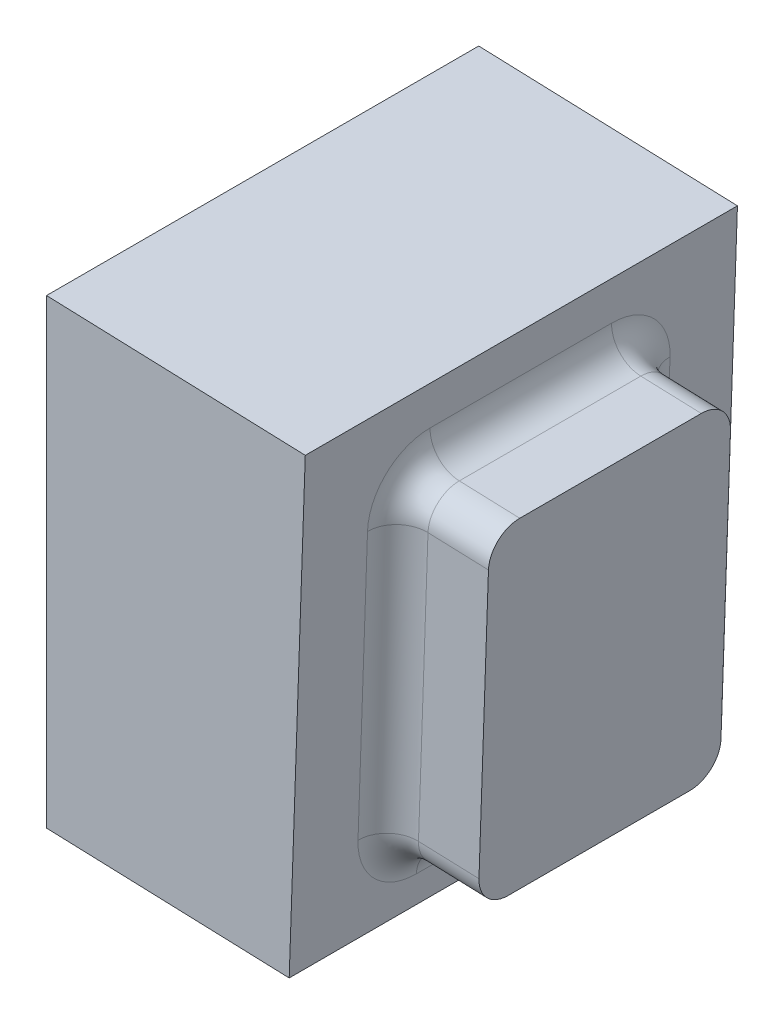
ISO-10303-21;
HEADER;
FILE_DESCRIPTION(('STEP AP214'),'2;1');
FILE_NAME('part.step','',(''),(''),'','','');
FILE_SCHEMA(('AUTOMOTIVE_DESIGN { 1 0 10303 214 1 1 1 1 }'));
ENDSEC;
DATA;
#1=APPLICATION_CONTEXT('core data for automotive mechanical design processes');
#2=APPLICATION_PROTOCOL_DEFINITION('international standard','automotive_design',2000,#1);
#3=PRODUCT_CONTEXT('',#1,'mechanical');
#4=PRODUCT('Part','Part','',(#3));
#5=PRODUCT_RELATED_PRODUCT_CATEGORY('part','',(#4));
#6=PRODUCT_DEFINITION_FORMATION('','',#4);
#7=PRODUCT_DEFINITION_CONTEXT('part definition',#1,'design');
#8=PRODUCT_DEFINITION('design','',#6,#7);
#9=PRODUCT_DEFINITION_SHAPE('','',#8);
#10=(LENGTH_UNIT() NAMED_UNIT(*) SI_UNIT(.MILLI.,.METRE.));
#11=(NAMED_UNIT(*) PLANE_ANGLE_UNIT() SI_UNIT($,.RADIAN.));
#12=(NAMED_UNIT(*) SI_UNIT($,.STERADIAN.) SOLID_ANGLE_UNIT());
#13=UNCERTAINTY_MEASURE_WITH_UNIT(LENGTH_MEASURE(1.E-05),#10,'distance_accuracy_value','');
#14=(GEOMETRIC_REPRESENTATION_CONTEXT(3) GLOBAL_UNCERTAINTY_ASSIGNED_CONTEXT((#13)) GLOBAL_UNIT_ASSIGNED_CONTEXT((#10,
#11,#12)) REPRESENTATION_CONTEXT('',''));
#15=CARTESIAN_POINT('',(0.,0.,0.));
#16=DIRECTION('',(0.,0.,1.));
#17=DIRECTION('',(1.,0.,0.));
#18=AXIS2_PLACEMENT_3D('',#15,#16,#17);
#19=CARTESIAN_POINT('',(-76.5787617492783,82.759769520535,9.34046375555881));
#20=DIRECTION('',(-0.034899496702501,-0.999390827019096,0.));
#21=DIRECTION('',(0.999390827019096,-0.034899496702501,0.));
#22=AXIS2_PLACEMENT_3D('',#19,#20,#21);
#23=PLANE('',#22);
#24=DIRECTION('',(0.,0.,1.));
#25=VECTOR('',#24,1.);
#26=CARTESIAN_POINT('',(-85.,83.0538456403235,48.));
#27=LINE('',#26,#25);
#28=CARTESIAN_POINT('',(-85.,83.0538456403235,9.34046375555881));
#29=VERTEX_POINT('',#28);
#30=CARTESIAN_POINT('',(-85.,83.0538456403235,24.3404637555588));
#31=VERTEX_POINT('',#30);
#32=EDGE_CURVE('E227',#29,#31,#27,.T.);
#33=ORIENTED_EDGE('',*,*,#32,.F.);
#34=DIRECTION('',(-0.999390827019096,0.034899496702501,0.));
#35=VECTOR('',#34,1.);
#36=CARTESIAN_POINT('',(-76.5787617492783,82.759769520535,9.34046375555881));
#37=LINE('',#36,#35);
#38=CARTESIAN_POINT('',(-76.5787617492783,82.759769520535,9.34046375555881));
#39=VERTEX_POINT('',#38);
#40=EDGE_CURVE('E11',#39,#29,#37,.T.);
#41=ORIENTED_EDGE('',*,*,#40,.F.);
#42=DIRECTION('',(0.,0.,1.));
#43=VECTOR('',#42,1.);
#44=CARTESIAN_POINT('',(-76.5787617492783,82.759769520535,-36.7416593812754));
#45=LINE('',#44,#43);
#46=CARTESIAN_POINT('',(-76.5787617492783,82.759769520535,24.3404637555588));
#47=VERTEX_POINT('',#46);
#48=EDGE_CURVE('E240',#47,#39,#45,.F.);
#49=ORIENTED_EDGE('',*,*,#48,.F.);
#50=DIRECTION('',(-0.999390827019096,0.034899496702501,0.));
#51=VECTOR('',#50,1.);
#52=CARTESIAN_POINT('',(-76.5787617492783,82.759769520535,24.3404637555588));
#53=LINE('',#52,#51);
#54=EDGE_CURVE('E52',#47,#31,#53,.T.);
#55=ORIENTED_EDGE('',*,*,#54,.T.);
#56=EDGE_LOOP('',(#33,#41,#49,#55));
#57=FACE_BOUND('',#56,.T.);
#58=ADVANCED_FACE('F42',(#57),#23,.T.);
#59=CARTESIAN_POINT('',(-76.0203698020383,98.7500227528405,9.3404637555588));
#60=DIRECTION('',(0.,0.,-1.));
#61=DIRECTION('',(0.,1.,0.));
#62=AXIS2_PLACEMENT_3D('',#59,#60,#61);
#63=PLANE('',#62);
#64=DIRECTION('',(0.,-1.,0.));
#65=VECTOR('',#64,1.);
#66=CARTESIAN_POINT('',(-85.,63.7622062124586,9.34046375555881));
#67=LINE('',#66,#65);
#68=CARTESIAN_POINT('',(-85.,99.0635983491047,9.3404637555588));
#69=VERTEX_POINT('',#68);
#70=EDGE_CURVE('E231',#69,#29,#67,.T.);
#71=ORIENTED_EDGE('',*,*,#70,.F.);
#72=DIRECTION('',(-0.999390827019096,0.034899496702501,0.));
#73=VECTOR('',#72,1.);
#74=CARTESIAN_POINT('',(-76.0203698020383,98.7500227528405,9.3404637555588));
#75=LINE('',#74,#73);
#76=CARTESIAN_POINT('',(-76.0203698020383,98.7500227528402,9.34046375555881));
#77=VERTEX_POINT('',#76);
#78=EDGE_CURVE('E220',#77,#69,#75,.T.);
#79=ORIENTED_EDGE('',*,*,#78,.F.);
#80=DIRECTION('',(-0.034899496702501,-0.999390827019096,0.));
#81=VECTOR('',#80,1.);
#82=CARTESIAN_POINT('',(-76.7183597360883,78.7622062124586,9.34046375555881));
#83=LINE('',#82,#81);
#84=EDGE_CURVE('E243',#39,#77,#83,.F.);
#85=ORIENTED_EDGE('',*,*,#84,.F.);
#86=ORIENTED_EDGE('',*,*,#40,.T.);
#87=EDGE_LOOP('',(#71,#79,#85,#86));
#88=FACE_BOUND('',#87,.T.);
#89=ADVANCED_FACE('F420',(#88),#63,.T.);
#90=CARTESIAN_POINT('',(-76.0203698020383,98.7500227528405,24.3404637555588));
#91=DIRECTION('',(0.,0.,1.));
#92=DIRECTION('',(0.,-1.,0.));
#93=AXIS2_PLACEMENT_3D('',#90,#91,#92);
#94=PLANE('',#93);
#95=DIRECTION('',(0.,1.,0.));
#96=VECTOR('',#95,1.);
#97=CARTESIAN_POINT('',(-85.,63.7622062124586,24.3404637555588));
#98=LINE('',#97,#96);
#99=CARTESIAN_POINT('',(-85.,99.0635983491046,24.3404637555588));
#100=VERTEX_POINT('',#99);
#101=EDGE_CURVE('E237',#31,#100,#98,.T.);
#102=ORIENTED_EDGE('',*,*,#101,.F.);
#103=ORIENTED_EDGE('',*,*,#54,.F.);
#104=DIRECTION('',(0.034899496702501,0.999390827019096,0.));
#105=VECTOR('',#104,1.);
#106=CARTESIAN_POINT('',(-76.7183597360883,78.7622062124586,24.3404637555588));
#107=LINE('',#106,#105);
#108=CARTESIAN_POINT('',(-76.0203698020383,98.7500227528405,24.3404637555588));
#109=VERTEX_POINT('',#108);
#110=EDGE_CURVE('E46',#109,#47,#107,.F.);
#111=ORIENTED_EDGE('',*,*,#110,.F.);
#112=DIRECTION('',(-0.999390827019096,0.034899496702501,0.));
#113=VECTOR('',#112,1.);
#114=CARTESIAN_POINT('',(-76.0203698020383,98.7500227528405,24.3404637555588));
#115=LINE('',#114,#113);
#116=EDGE_CURVE('E223',#109,#100,#115,.T.);
#117=ORIENTED_EDGE('',*,*,#116,.T.);
#118=EDGE_LOOP('',(#102,#103,#111,#117));
#119=FACE_BOUND('',#118,.T.);
#120=ADVANCED_FACE('F261',(#119),#94,.T.);
#121=CARTESIAN_POINT('',(-76.0203698020383,98.7500227528405,9.3404637555588));
#122=DIRECTION('',(0.034899496702501,0.999390827019096,0.));
#123=DIRECTION('',(-0.999390827019096,0.034899496702501,0.));
#124=AXIS2_PLACEMENT_3D('',#121,#122,#123);
#125=PLANE('',#124);
#126=DIRECTION('',(0.,0.,-1.));
#127=VECTOR('',#126,1.);
#128=CARTESIAN_POINT('',(-85.,99.0635983491046,48.));
#129=LINE('',#128,#127);
#130=EDGE_CURVE('E234',#100,#69,#129,.T.);
#131=ORIENTED_EDGE('',*,*,#130,.F.);
#132=ORIENTED_EDGE('',*,*,#116,.F.);
#133=DIRECTION('',(0.,0.,-1.));
#134=VECTOR('',#133,1.);
#135=CARTESIAN_POINT('',(-76.0203698020383,98.7500227528405,-36.7416593812754));
#136=LINE('',#135,#134);
#137=EDGE_CURVE('E245',#77,#109,#136,.F.);
#138=ORIENTED_EDGE('',*,*,#137,.F.);
#139=ORIENTED_EDGE('',*,*,#78,.T.);
#140=EDGE_LOOP('',(#131,#132,#138,#139));
#141=FACE_BOUND('',#140,.T.);
#142=ADVANCED_FACE('F413',(#141),#125,.T.);
#143=CARTESIAN_POINT('',(-85.,63.7622062124586,48.));
#144=DIRECTION('',(-1.,0.,0.));
#145=DIRECTION('',(0.,0.,1.));
#146=AXIS2_PLACEMENT_3D('',#143,#144,#145);
#147=PLANE('',#146);
#148=ORIENTED_EDGE('',*,*,#32,.T.);
#149=ORIENTED_EDGE('',*,*,#101,.T.);
#150=ORIENTED_EDGE('',*,*,#130,.T.);
#151=ORIENTED_EDGE('',*,*,#70,.T.);
#152=EDGE_LOOP('',(#148,#149,#150,#151));
#153=FACE_BOUND('',#152,.T.);
#154=ADVANCED_FACE('F411',(#153),#147,.T.);
#155=CARTESIAN_POINT('',(-76.7183597360883,78.7622062124586,-36.7416593812754));
#156=DIRECTION('',(-0.999390827019096,0.034899496702501,0.));
#157=DIRECTION('',(-0.034899496702501,-0.999390827019096,0.));
#158=AXIS2_PLACEMENT_3D('',#155,#156,#157);
#159=PLANE('',#158);
#160=DIRECTION('',(-0.034899496702501,-0.999390827019096,0.));
#161=VECTOR('',#160,1.);
#162=CARTESIAN_POINT('',(-76.7183597360883,78.7622062124586,11.5583406187246));
#163=LINE('',#162,#161);
#164=CARTESIAN_POINT('',(-76.4720545661556,85.8154634435414,11.5583406187247));
#165=VERTEX_POINT('',#164);
#166=CARTESIAN_POINT('',(-76.142254322317,95.259706758871,11.5583406187247));
#167=VERTEX_POINT('',#166);
#168=EDGE_CURVE('E173',#165,#167,#163,.F.);
#169=ORIENTED_EDGE('',*,*,#168,.F.);
#170=CARTESIAN_POINT('',(-76.4720545661556,85.8154634435414,13.6583406187247));
#171=DIRECTION('',(-0.999390827019096,0.034899496702501,0.));
#172=DIRECTION('',(-0.034899496702501,-0.999390827019096,0.));
#173=AXIS2_PLACEMENT_3D('',#170,#171,#172);
#174=CIRCLE('',#173,2.1);
#175=CARTESIAN_POINT('',(-76.5453435092309,83.7167427068013,13.6583406187247));
#176=VERTEX_POINT('',#175);
#177=EDGE_CURVE('E209',#176,#165,#174,.F.);
#178=ORIENTED_EDGE('',*,*,#177,.F.);
#179=DIRECTION('',(0.,0.,1.));
#180=VECTOR('',#179,1.);
#181=CARTESIAN_POINT('',(-76.5453435092309,83.7167427068013,-36.7416593812754));
#182=LINE('',#181,#180);
#183=CARTESIAN_POINT('',(-76.5453435092309,83.7167427068013,19.9583406187246));
#184=VERTEX_POINT('',#183);
#185=EDGE_CURVE('E203',#184,#176,#182,.F.);
#186=ORIENTED_EDGE('',*,*,#185,.F.);
#187=CARTESIAN_POINT('',(-76.4720545661556,85.8154634435414,19.9583406187246));
#188=DIRECTION('',(-0.999390827019096,0.034899496702501,0.));
#189=DIRECTION('',(-0.034899496702501,-0.999390827019096,0.));
#190=AXIS2_PLACEMENT_3D('',#187,#188,#189);
#191=CIRCLE('',#190,2.1);
#192=CARTESIAN_POINT('',(-76.4720545661556,85.8154634435414,22.0583406187246));
#193=VERTEX_POINT('',#192);
#194=EDGE_CURVE('E195',#193,#184,#191,.F.);
#195=ORIENTED_EDGE('',*,*,#194,.F.);
#196=DIRECTION('',(-0.034899496702501,-0.999390827019096,0.));
#197=VECTOR('',#196,1.);
#198=CARTESIAN_POINT('',(-76.4720545661556,85.8154634435414,22.0583406187246));
#199=LINE('',#198,#197);
#200=CARTESIAN_POINT('',(-76.142254322317,95.259706758871,22.0583406187246));
#201=VERTEX_POINT('',#200);
#202=EDGE_CURVE('E189',#201,#193,#199,.T.);
#203=ORIENTED_EDGE('',*,*,#202,.F.);
#204=CARTESIAN_POINT('',(-76.142254322317,95.259706758871,19.9583406187246));
#205=DIRECTION('',(-0.999390827019096,0.034899496702501,0.));
#206=DIRECTION('',(-0.034899496702501,-0.999390827019096,0.));
#207=AXIS2_PLACEMENT_3D('',#204,#205,#206);
#208=CIRCLE('',#207,2.1);
#209=CARTESIAN_POINT('',(-76.0689653792418,97.3584274956112,19.9583406187246));
#210=VERTEX_POINT('',#209);
#211=EDGE_CURVE('E182',#210,#201,#208,.F.);
#212=ORIENTED_EDGE('',*,*,#211,.F.);
#213=DIRECTION('',(0.,0.,1.));
#214=VECTOR('',#213,1.);
#215=CARTESIAN_POINT('',(-76.0689653792418,97.3584274956112,19.9583406187246));
#216=LINE('',#215,#214);
#217=CARTESIAN_POINT('',(-76.0689653792418,97.3584274956112,13.6583406187247));
#218=VERTEX_POINT('',#217);
#219=EDGE_CURVE('E178',#218,#210,#216,.T.);
#220=ORIENTED_EDGE('',*,*,#219,.F.);
#221=CARTESIAN_POINT('',(-76.142254322317,95.259706758871,13.6583406187247));
#222=DIRECTION('',(-0.999390827019096,0.034899496702501,0.));
#223=DIRECTION('',(-0.034899496702501,-0.999390827019096,0.));
#224=AXIS2_PLACEMENT_3D('',#221,#222,#223);
#225=CIRCLE('',#224,2.1);
#226=EDGE_CURVE('E170',#167,#218,#225,.F.);
#227=ORIENTED_EDGE('',*,*,#226,.F.);
#228=EDGE_LOOP('',(#169,#178,#186,#195,#203,#212,#220,#227));
#229=FACE_BOUND('',#228,.T.);
#230=ORIENTED_EDGE('',*,*,#137,.T.);
#231=ORIENTED_EDGE('',*,*,#110,.T.);
#232=ORIENTED_EDGE('',*,*,#48,.T.);
#233=ORIENTED_EDGE('',*,*,#84,.T.);
#234=EDGE_LOOP('',(#230,#231,#232,#233));
#235=FACE_BOUND('',#234,.T.);
#236=ADVANCED_FACE('F44',(#229,#235),#159,.F.);
#237=CARTESIAN_POINT('',(-73.4823845266282,81.1692306320884,0.));
#238=DIRECTION('',(-0.999390827019096,0.0348994967024996,0.));
#239=DIRECTION('',(-0.0348994967024996,-0.999390827019096,0.));
#240=AXIS2_PLACEMENT_3D('',#237,#238,#239);
#241=PLANE('',#240);
#242=DIRECTION('',(-0.034899496702501,-0.999390827019096,0.));
#243=VECTOR('',#242,1.);
#244=CARTESIAN_POINT('',(-73.5702786309782,78.6522727978457,12.6083406187247));
#245=LINE('',#244,#243);
#246=CARTESIAN_POINT('',(-73.3239734610455,85.7055300289285,12.6083406187247));
#247=VERTEX_POINT('',#246);
#248=CARTESIAN_POINT('',(-72.9941732172069,95.1497733442582,12.6083406187247));
#249=VERTEX_POINT('',#248);
#250=EDGE_CURVE('E116',#247,#249,#245,.F.);
#251=ORIENTED_EDGE('',*,*,#250,.T.);
#252=CARTESIAN_POINT('',(-72.9941732172069,95.1497733442582,13.6583406187247));
#253=DIRECTION('',(-0.999390827019096,0.034899496702501,0.));
#254=DIRECTION('',(-0.034899496702501,-0.999390827019096,0.));
#255=AXIS2_PLACEMENT_3D('',#252,#253,#254);
#256=CIRCLE('',#255,1.05);
#257=CARTESIAN_POINT('',(-72.9575287456693,96.1991337126282,13.6583406187247));
#258=VERTEX_POINT('',#257);
#259=EDGE_CURVE('E120',#258,#249,#256,.T.);
#260=ORIENTED_EDGE('',*,*,#259,.F.);
#261=DIRECTION('',(0.,0.,1.));
#262=VECTOR('',#261,1.);
#263=CARTESIAN_POINT('',(-72.9575287456693,96.1991337126282,-36.7416593812754));
#264=LINE('',#263,#262);
#265=CARTESIAN_POINT('',(-72.9575287456693,96.1991337126282,19.9583406187246));
#266=VERTEX_POINT('',#265);
#267=EDGE_CURVE('E124',#266,#258,#264,.F.);
#268=ORIENTED_EDGE('',*,*,#267,.F.);
#269=CARTESIAN_POINT('',(-72.9941732172069,95.1497733442582,19.9583406187246));
#270=DIRECTION('',(-0.999390827019096,0.034899496702501,0.));
#271=DIRECTION('',(-0.034899496702501,-0.999390827019096,0.));
#272=AXIS2_PLACEMENT_3D('',#269,#270,#271);
#273=CIRCLE('',#272,1.05);
#274=CARTESIAN_POINT('',(-72.9941732172069,95.1497733442582,21.0083406187246));
#275=VERTEX_POINT('',#274);
#276=EDGE_CURVE('E150',#275,#266,#273,.T.);
#277=ORIENTED_EDGE('',*,*,#276,.F.);
#278=DIRECTION('',(-0.034899496702501,-0.999390827019096,0.));
#279=VECTOR('',#278,1.);
#280=CARTESIAN_POINT('',(-73.5702786309781,78.6522727978457,21.0083406187246));
#281=LINE('',#280,#279);
#282=CARTESIAN_POINT('',(-73.3239734610455,85.7055300289285,21.0083406187246));
#283=VERTEX_POINT('',#282);
#284=EDGE_CURVE('E348',#283,#275,#281,.F.);
#285=ORIENTED_EDGE('',*,*,#284,.F.);
#286=CARTESIAN_POINT('',(-73.3239734610455,85.7055300289285,19.9583406187246));
#287=DIRECTION('',(-0.999390827019096,0.034899496702501,0.));
#288=DIRECTION('',(-0.034899496702501,-0.999390827019096,0.));
#289=AXIS2_PLACEMENT_3D('',#286,#287,#288);
#290=CIRCLE('',#289,1.05);
#291=CARTESIAN_POINT('',(-73.3606179325831,84.6561696605585,19.9583406187246));
#292=VERTEX_POINT('',#291);
#293=EDGE_CURVE('E319',#292,#283,#290,.T.);
#294=ORIENTED_EDGE('',*,*,#293,.F.);
#295=DIRECTION('',(0.,0.,1.));
#296=VECTOR('',#295,1.);
#297=CARTESIAN_POINT('',(-73.3606179325831,84.6561696605585,-36.7416593812754));
#298=LINE('',#297,#296);
#299=CARTESIAN_POINT('',(-73.3606179325831,84.6561696605585,13.6583406187247));
#300=VERTEX_POINT('',#299);
#301=EDGE_CURVE('E230',#292,#300,#298,.F.);
#302=ORIENTED_EDGE('',*,*,#301,.T.);
#303=CARTESIAN_POINT('',(-73.3239734610455,85.7055300289285,13.6583406187247));
#304=DIRECTION('',(-0.999390827019096,0.034899496702501,0.));
#305=DIRECTION('',(-0.034899496702501,-0.999390827019096,0.));
#306=AXIS2_PLACEMENT_3D('',#303,#304,#305);
#307=CIRCLE('',#306,1.05);
#308=EDGE_CURVE('E315',#247,#300,#307,.T.);
#309=ORIENTED_EDGE('',*,*,#308,.F.);
#310=EDGE_LOOP('',(#251,#260,#268,#277,#285,#294,#302,#309));
#311=FACE_BOUND('',#310,.T.);
#312=ADVANCED_FACE('F122',(#311),#241,.F.);
#313=CARTESIAN_POINT('',(-65.6486506386165,94.8932620434948,13.6583406187246));
#314=DIRECTION('',(-0.999390827019096,0.034899496702501,0.));
#315=DIRECTION('',(-0.034899496702501,-0.999390827019096,0.));
#316=AXIS2_PLACEMENT_3D('',#313,#314,#315);
#317=CYLINDRICAL_SURFACE('',#316,1.05);
#318=DIRECTION('',(-0.999390827019096,0.034899496702501,0.));
#319=VECTOR('',#318,1.);
#320=CARTESIAN_POINT('',(-65.6120061670789,95.9426224118648,13.6583406187247));
#321=LINE('',#320,#319);
#322=CARTESIAN_POINT('',(-75.0562494824094,96.2724226557035,13.6583406187247));
#323=VERTEX_POINT('',#322);
#324=EDGE_CURVE('E129',#323,#258,#321,.F.);
#325=ORIENTED_EDGE('',*,*,#324,.T.);
#326=ORIENTED_EDGE('',*,*,#259,.T.);
#327=DIRECTION('',(-0.999390827019096,0.034899496702501,0.));
#328=VECTOR('',#327,1.);
#329=CARTESIAN_POINT('',(-65.6486506386165,94.8932620434948,12.6083406187246));
#330=LINE('',#329,#328);
#331=CARTESIAN_POINT('',(-75.092893953947,95.2230622873334,12.6083406187247));
#332=VERTEX_POINT('',#331);
#333=EDGE_CURVE('E130',#249,#332,#330,.T.);
#334=ORIENTED_EDGE('',*,*,#333,.T.);
#335=CARTESIAN_POINT('',(-75.092893953947,95.2230622873334,13.6583406187247));
#336=DIRECTION('',(-0.999390827019096,0.034899496702501,0.));
#337=DIRECTION('',(-0.034899496702501,-0.999390827019096,0.));
#338=AXIS2_PLACEMENT_3D('',#335,#336,#337);
#339=CIRCLE('',#338,1.05);
#340=EDGE_CURVE('E136',#323,#332,#339,.T.);
#341=ORIENTED_EDGE('',*,*,#340,.F.);
#342=EDGE_LOOP('',(#325,#326,#334,#341));
#343=FACE_BOUND('',#342,.T.);
#344=ADVANCED_FACE('F134',(#343),#317,.T.);
#345=CARTESIAN_POINT('',(-65.6120061670789,95.9426224118648,-36.7416593812754));
#346=DIRECTION('',(-0.034899496702501,-0.999390827019096,0.));
#347=DIRECTION('',(0.999390827019096,-0.034899496702501,0.));
#348=AXIS2_PLACEMENT_3D('',#345,#346,#347);
#349=PLANE('',#348);
#350=DIRECTION('',(-0.999390827019096,0.034899496702501,0.));
#351=VECTOR('',#350,1.);
#352=CARTESIAN_POINT('',(-76.1056098507794,96.3090671272411,19.9583406187246));
#353=LINE('',#352,#351);
#354=CARTESIAN_POINT('',(-75.0562494824094,96.2724226557035,19.9583406187246));
#355=VERTEX_POINT('',#354);
#356=EDGE_CURVE('E142',#266,#355,#353,.T.);
#357=ORIENTED_EDGE('',*,*,#356,.F.);
#358=ORIENTED_EDGE('',*,*,#267,.T.);
#359=ORIENTED_EDGE('',*,*,#324,.F.);
#360=DIRECTION('',(0.,0.,-1.));
#361=VECTOR('',#360,1.);
#362=CARTESIAN_POINT('',(-75.0562494824094,96.2724226557035,13.6583406187247));
#363=LINE('',#362,#361);
#364=EDGE_CURVE('E168',#355,#323,#363,.T.);
#365=ORIENTED_EDGE('',*,*,#364,.F.);
#366=EDGE_LOOP('',(#357,#358,#359,#365));
#367=FACE_BOUND('',#366,.T.);
#368=ADVANCED_FACE('F140',(#367),#349,.F.);
#369=CARTESIAN_POINT('',(-65.6486506386165,94.8932620434948,19.9583406187246));
#370=DIRECTION('',(0.999390827019096,-0.034899496702501,0.));
#371=DIRECTION('',(0.034899496702501,0.999390827019096,0.));
#372=AXIS2_PLACEMENT_3D('',#369,#370,#371);
#373=CYLINDRICAL_SURFACE('',#372,1.05);
#374=DIRECTION('',(-0.999390827019096,0.034899496702501,0.));
#375=VECTOR('',#374,1.);
#376=CARTESIAN_POINT('',(-72.9941732172069,95.1497733442582,21.0083406187246));
#377=LINE('',#376,#375);
#378=CARTESIAN_POINT('',(-75.092893953947,95.2230622873334,21.0083406187246));
#379=VERTEX_POINT('',#378);
#380=EDGE_CURVE('E352',#379,#275,#377,.F.);
#381=ORIENTED_EDGE('',*,*,#380,.T.);
#382=ORIENTED_EDGE('',*,*,#276,.T.);
#383=ORIENTED_EDGE('',*,*,#356,.T.);
#384=CARTESIAN_POINT('',(-75.092893953947,95.2230622873334,19.9583406187246));
#385=DIRECTION('',(-0.999390827019096,0.034899496702501,0.));
#386=DIRECTION('',(-0.034899496702501,-0.999390827019096,0.));
#387=AXIS2_PLACEMENT_3D('',#384,#385,#386);
#388=CIRCLE('',#387,1.05);
#389=EDGE_CURVE('E154',#379,#355,#388,.T.);
#390=ORIENTED_EDGE('',*,*,#389,.F.);
#391=EDGE_LOOP('',(#381,#382,#383,#390));
#392=FACE_BOUND('',#391,.T.);
#393=ADVANCED_FACE('F363',(#392),#373,.T.);
#394=CARTESIAN_POINT('',(-66.2247560523878,78.3957614970823,21.0083406187246));
#395=DIRECTION('',(0.,0.,-1.));
#396=DIRECTION('',(-1.,0.,0.));
#397=AXIS2_PLACEMENT_3D('',#394,#395,#396);
#398=PLANE('',#397);
#399=DIRECTION('',(-0.999390827019096,0.034899496702501,0.));
#400=VECTOR('',#399,1.);
#401=CARTESIAN_POINT('',(-65.9784508824551,85.4490187281651,21.0083406187246));
#402=LINE('',#401,#400);
#403=CARTESIAN_POINT('',(-75.4226941977856,85.7788189720038,21.0083406187246));
#404=VERTEX_POINT('',#403);
#405=EDGE_CURVE('E338',#283,#404,#402,.T.);
#406=ORIENTED_EDGE('',*,*,#405,.F.);
#407=ORIENTED_EDGE('',*,*,#284,.T.);
#408=ORIENTED_EDGE('',*,*,#380,.F.);
#409=DIRECTION('',(0.034899496702501,0.999390827019096,0.));
#410=VECTOR('',#409,1.);
#411=CARTESIAN_POINT('',(-75.092893953947,95.2230622873334,21.0083406187246));
#412=LINE('',#411,#410);
#413=EDGE_CURVE('E188',#404,#379,#412,.T.);
#414=ORIENTED_EDGE('',*,*,#413,.F.);
#415=EDGE_LOOP('',(#406,#407,#408,#414));
#416=FACE_BOUND('',#415,.T.);
#417=ADVANCED_FACE('F370',(#416),#398,.F.);
#418=CARTESIAN_POINT('',(-65.9784508824551,85.4490187281651,19.9583406187246));
#419=DIRECTION('',(-0.999390827019096,0.034899496702501,0.));
#420=DIRECTION('',(-0.034899496702501,-0.999390827019096,0.));
#421=AXIS2_PLACEMENT_3D('',#418,#419,#420);
#422=CYLINDRICAL_SURFACE('',#421,1.05);
#423=DIRECTION('',(-0.999390827019096,0.034899496702501,0.));
#424=VECTOR('',#423,1.);
#425=CARTESIAN_POINT('',(-66.0150953539928,84.3996583597951,19.9583406187246));
#426=LINE('',#425,#424);
#427=CARTESIAN_POINT('',(-75.4593386693232,84.7294586036337,19.9583406187246));
#428=VERTEX_POINT('',#427);
#429=EDGE_CURVE('E311',#428,#292,#426,.F.);
#430=ORIENTED_EDGE('',*,*,#429,.T.);
#431=ORIENTED_EDGE('',*,*,#293,.T.);
#432=ORIENTED_EDGE('',*,*,#405,.T.);
#433=CARTESIAN_POINT('',(-75.4226941977856,85.7788189720038,19.9583406187246));
#434=DIRECTION('',(-0.999390827019096,0.034899496702501,0.));
#435=DIRECTION('',(-0.034899496702501,-0.999390827019096,0.));
#436=AXIS2_PLACEMENT_3D('',#433,#434,#435);
#437=CIRCLE('',#436,1.05);
#438=EDGE_CURVE('E202',#428,#404,#437,.T.);
#439=ORIENTED_EDGE('',*,*,#438,.F.);
#440=EDGE_LOOP('',(#430,#431,#432,#439));
#441=FACE_BOUND('',#440,.T.);
#442=ADVANCED_FACE('F372',(#441),#422,.T.);
#443=CARTESIAN_POINT('',(-66.0150953539928,84.3996583597951,-36.7416593812754));
#444=DIRECTION('',(-0.034899496702501,-0.999390827019096,0.));
#445=DIRECTION('',(0.999390827019096,-0.034899496702501,0.));
#446=AXIS2_PLACEMENT_3D('',#443,#444,#445);
#447=PLANE('',#446);
#448=DIRECTION('',(-0.999390827019096,0.034899496702501,0.));
#449=VECTOR('',#448,1.);
#450=CARTESIAN_POINT('',(-76.5086990376933,84.7661030751713,13.6583406187247));
#451=LINE('',#450,#449);
#452=CARTESIAN_POINT('',(-75.4593386693232,84.7294586036337,13.6583406187247));
#453=VERTEX_POINT('',#452);
#454=EDGE_CURVE('E308',#300,#453,#451,.T.);
#455=ORIENTED_EDGE('',*,*,#454,.F.);
#456=ORIENTED_EDGE('',*,*,#301,.F.);
#457=ORIENTED_EDGE('',*,*,#429,.F.);
#458=DIRECTION('',(0.,0.,-1.));
#459=VECTOR('',#458,1.);
#460=CARTESIAN_POINT('',(-75.4593386693232,84.7294586036337,-36.7416593812754));
#461=LINE('',#460,#459);
#462=EDGE_CURVE('E208',#453,#428,#461,.F.);
#463=ORIENTED_EDGE('',*,*,#462,.F.);
#464=EDGE_LOOP('',(#455,#456,#457,#463));
#465=FACE_BOUND('',#464,.T.);
#466=ADVANCED_FACE('F306',(#465),#447,.T.);
#467=CARTESIAN_POINT('',(-65.9784508824551,85.4490187281651,13.6583406187247));
#468=DIRECTION('',(0.999390827019096,-0.034899496702501,0.));
#469=DIRECTION('',(0.034899496702501,0.999390827019096,0.));
#470=AXIS2_PLACEMENT_3D('',#467,#468,#469);
#471=CYLINDRICAL_SURFACE('',#470,1.05);
#472=DIRECTION('',(-0.999390827019096,0.034899496702501,0.));
#473=VECTOR('',#472,1.);
#474=CARTESIAN_POINT('',(-73.3239734610455,85.7055300289285,12.6083406187247));
#475=LINE('',#474,#473);
#476=CARTESIAN_POINT('',(-75.4226941977856,85.7788189720038,12.6083406187247));
#477=VERTEX_POINT('',#476);
#478=EDGE_CURVE('E226',#477,#247,#475,.F.);
#479=ORIENTED_EDGE('',*,*,#478,.T.);
#480=ORIENTED_EDGE('',*,*,#308,.T.);
#481=ORIENTED_EDGE('',*,*,#454,.T.);
#482=CARTESIAN_POINT('',(-75.4226941977856,85.7788189720038,13.6583406187247));
#483=DIRECTION('',(-0.999390827019096,0.034899496702501,0.));
#484=DIRECTION('',(-0.034899496702501,-0.999390827019096,0.));
#485=AXIS2_PLACEMENT_3D('',#482,#483,#484);
#486=CIRCLE('',#485,1.05);
#487=EDGE_CURVE('E215',#477,#453,#486,.T.);
#488=ORIENTED_EDGE('',*,*,#487,.F.);
#489=EDGE_LOOP('',(#479,#480,#481,#488));
#490=FACE_BOUND('',#489,.T.);
#491=ADVANCED_FACE('F314',(#490),#471,.T.);
#492=CARTESIAN_POINT('',(-66.2247560523878,78.3957614970823,12.6083406187246));
#493=DIRECTION('',(0.,0.,-1.));
#494=DIRECTION('',(-1.,0.,0.));
#495=AXIS2_PLACEMENT_3D('',#492,#493,#494);
#496=PLANE('',#495);
#497=ORIENTED_EDGE('',*,*,#333,.F.);
#498=ORIENTED_EDGE('',*,*,#250,.F.);
#499=ORIENTED_EDGE('',*,*,#478,.F.);
#500=DIRECTION('',(0.034899496702501,0.999390827019096,0.));
#501=VECTOR('',#500,1.);
#502=CARTESIAN_POINT('',(-75.6689993677182,78.725561740921,12.6083406187247));
#503=LINE('',#502,#501);
#504=EDGE_CURVE('E61',#332,#477,#503,.F.);
#505=ORIENTED_EDGE('',*,*,#504,.F.);
#506=EDGE_LOOP('',(#497,#498,#499,#505));
#507=FACE_BOUND('',#506,.T.);
#508=ADVANCED_FACE('F375',(#507),#496,.T.);
#509=CARTESIAN_POINT('',(-75.092893953947,95.2230622873334,13.6583406187247));
#510=DIRECTION('',(-0.999390827019096,0.034899496702501,0.));
#511=DIRECTION('',(-0.034899496702501,-0.999390827019096,0.));
#512=AXIS2_PLACEMENT_3D('',#509,#510,#511);
#513=TOROIDAL_SURFACE('',#512,2.1,1.05);
#514=CARTESIAN_POINT('',(-75.092893953947,95.2230622873334,11.5583406187247));
#515=DIRECTION('',(0.0348994967025,0.999390827019096,0.));
#516=DIRECTION('',(-0.999390827019096,0.0348994967025,0.));
#517=AXIS2_PLACEMENT_3D('',#514,#515,#516);
#518=CIRCLE('',#517,1.05);
#519=EDGE_CURVE('E171',#167,#332,#518,.T.);
#520=ORIENTED_EDGE('',*,*,#519,.F.);
#521=ORIENTED_EDGE('',*,*,#226,.T.);
#522=CARTESIAN_POINT('',(-75.0196050108717,97.3217830240735,13.6583406187247));
#523=DIRECTION('',(0.,0.,-1.));
#524=DIRECTION('',(-1.,0.,0.));
#525=AXIS2_PLACEMENT_3D('',#522,#523,#524);
#526=CIRCLE('',#525,1.05);
#527=EDGE_CURVE('E175',#323,#218,#526,.T.);
#528=ORIENTED_EDGE('',*,*,#527,.F.);
#529=ORIENTED_EDGE('',*,*,#340,.T.);
#530=EDGE_LOOP('',(#520,#521,#528,#529));
#531=FACE_BOUND('',#530,.T.);
#532=ADVANCED_FACE('F389',(#531),#513,.F.);
#533=CARTESIAN_POINT('',(-75.0196050108717,97.3217830240735,-36.7416593812754));
#534=DIRECTION('',(0.,0.,1.));
#535=DIRECTION('',(1.,0.,0.));
#536=AXIS2_PLACEMENT_3D('',#533,#534,#535);
#537=CYLINDRICAL_SURFACE('',#536,1.05);
#538=CARTESIAN_POINT('',(-75.0196050108717,97.3217830240735,19.9583406187246));
#539=DIRECTION('',(0.,0.,-1.));
#540=DIRECTION('',(-1.,0.,0.));
#541=AXIS2_PLACEMENT_3D('',#538,#539,#540);
#542=CIRCLE('',#541,1.05);
#543=EDGE_CURVE('E179',#355,#210,#542,.T.);
#544=ORIENTED_EDGE('',*,*,#543,.F.);
#545=ORIENTED_EDGE('',*,*,#364,.T.);
#546=ORIENTED_EDGE('',*,*,#527,.T.);
#547=ORIENTED_EDGE('',*,*,#219,.T.);
#548=EDGE_LOOP('',(#544,#545,#546,#547));
#549=FACE_BOUND('',#548,.T.);
#550=ADVANCED_FACE('F393',(#549),#537,.F.);
#551=CARTESIAN_POINT('',(-75.092893953947,95.2230622873334,19.9583406187246));
#552=DIRECTION('',(-0.999390827019096,0.034899496702501,0.));
#553=DIRECTION('',(-0.034899496702501,-0.999390827019096,0.));
#554=AXIS2_PLACEMENT_3D('',#551,#552,#553);
#555=TOROIDAL_SURFACE('',#554,2.1,1.05);
#556=CARTESIAN_POINT('',(-75.092893953947,95.2230622873334,22.0583406187246));
#557=DIRECTION('',(0.0348994967024963,0.999390827019096,0.));
#558=DIRECTION('',(-0.999390827019096,0.0348994967024963,0.));
#559=AXIS2_PLACEMENT_3D('',#556,#557,#558);
#560=CIRCLE('',#559,1.05);
#561=EDGE_CURVE('E185',#379,#201,#560,.T.);
#562=ORIENTED_EDGE('',*,*,#561,.F.);
#563=ORIENTED_EDGE('',*,*,#389,.T.);
#564=ORIENTED_EDGE('',*,*,#543,.T.);
#565=ORIENTED_EDGE('',*,*,#211,.T.);
#566=EDGE_LOOP('',(#562,#563,#564,#565));
#567=FACE_BOUND('',#566,.T.);
#568=ADVANCED_FACE('F397',(#567),#555,.F.);
#569=CARTESIAN_POINT('',(-75.6689993677182,78.725561740921,22.0583406187246));
#570=DIRECTION('',(-0.034899496702501,-0.999390827019096,0.));
#571=DIRECTION('',(0.999390827019096,-0.034899496702501,0.));
#572=AXIS2_PLACEMENT_3D('',#569,#570,#571);
#573=CYLINDRICAL_SURFACE('',#572,1.05);
#574=CARTESIAN_POINT('',(-75.4226941977856,85.7788189720038,22.0583406187246));
#575=DIRECTION('',(0.0348994967024992,0.999390827019096,0.));
#576=DIRECTION('',(-0.999390827019096,0.0348994967024992,0.));
#577=AXIS2_PLACEMENT_3D('',#574,#575,#576);
#578=CIRCLE('',#577,1.05);
#579=EDGE_CURVE('E192',#404,#193,#578,.T.);
#580=ORIENTED_EDGE('',*,*,#579,.F.);
#581=ORIENTED_EDGE('',*,*,#413,.T.);
#582=ORIENTED_EDGE('',*,*,#561,.T.);
#583=ORIENTED_EDGE('',*,*,#202,.T.);
#584=EDGE_LOOP('',(#580,#581,#582,#583));
#585=FACE_BOUND('',#584,.T.);
#586=ADVANCED_FACE('F400',(#585),#573,.F.);
#587=CARTESIAN_POINT('',(-75.4226941977856,85.7788189720038,19.9583406187246));
#588=DIRECTION('',(-0.999390827019096,0.034899496702501,0.));
#589=DIRECTION('',(-0.034899496702501,-0.999390827019096,0.));
#590=AXIS2_PLACEMENT_3D('',#587,#588,#589);
#591=TOROIDAL_SURFACE('',#590,2.1,1.05);
#592=ORIENTED_EDGE('',*,*,#579,.T.);
#593=ORIENTED_EDGE('',*,*,#194,.T.);
#594=CARTESIAN_POINT('',(-75.4959831408608,83.6800982352637,19.9583406187246));
#595=DIRECTION('',(0.,0.,-1.));
#596=DIRECTION('',(0.,1.,0.));
#597=AXIS2_PLACEMENT_3D('',#594,#595,#596);
#598=CIRCLE('',#597,1.05);
#599=EDGE_CURVE('E200',#184,#428,#598,.T.);
#600=ORIENTED_EDGE('',*,*,#599,.T.);
#601=ORIENTED_EDGE('',*,*,#438,.T.);
#602=EDGE_LOOP('',(#592,#593,#600,#601));
#603=FACE_BOUND('',#602,.T.);
#604=ADVANCED_FACE('F402',(#603),#591,.F.);
#605=CARTESIAN_POINT('',(-75.4959831408609,83.6800982352637,-36.7416593812754));
#606=DIRECTION('',(0.,0.,-1.));
#607=DIRECTION('',(-1.,0.,0.));
#608=AXIS2_PLACEMENT_3D('',#605,#606,#607);
#609=CYLINDRICAL_SURFACE('',#608,1.05);
#610=ORIENTED_EDGE('',*,*,#599,.F.);
#611=ORIENTED_EDGE('',*,*,#185,.T.);
#612=CARTESIAN_POINT('',(-75.4959831408608,83.6800982352637,13.6583406187247));
#613=DIRECTION('',(0.,0.,-1.));
#614=DIRECTION('',(-1.,0.,0.));
#615=AXIS2_PLACEMENT_3D('',#612,#613,#614);
#616=CIRCLE('',#615,1.05);
#617=EDGE_CURVE('E206',#176,#453,#616,.T.);
#618=ORIENTED_EDGE('',*,*,#617,.T.);
#619=ORIENTED_EDGE('',*,*,#462,.T.);
#620=EDGE_LOOP('',(#610,#611,#618,#619));
#621=FACE_BOUND('',#620,.T.);
#622=ADVANCED_FACE('F287',(#621),#609,.F.);
#623=CARTESIAN_POINT('',(-75.4226941977856,85.7788189720038,13.6583406187247));
#624=DIRECTION('',(-0.999390827019096,0.034899496702501,0.));
#625=DIRECTION('',(-0.034899496702501,-0.999390827019096,0.));
#626=AXIS2_PLACEMENT_3D('',#623,#624,#625);
#627=TOROIDAL_SURFACE('',#626,2.1,1.05);
#628=ORIENTED_EDGE('',*,*,#617,.F.);
#629=ORIENTED_EDGE('',*,*,#177,.T.);
#630=CARTESIAN_POINT('',(-75.4226941977856,85.7788189720038,11.5583406187247));
#631=DIRECTION('',(0.0348994967025009,0.999390827019096,0.));
#632=DIRECTION('',(-0.999390827019096,0.0348994967025009,0.));
#633=AXIS2_PLACEMENT_3D('',#630,#631,#632);
#634=CIRCLE('',#633,1.05);
#635=EDGE_CURVE('E212',#165,#477,#634,.T.);
#636=ORIENTED_EDGE('',*,*,#635,.T.);
#637=ORIENTED_EDGE('',*,*,#487,.T.);
#638=EDGE_LOOP('',(#628,#629,#636,#637));
#639=FACE_BOUND('',#638,.T.);
#640=ADVANCED_FACE('F296',(#639),#627,.F.);
#641=CARTESIAN_POINT('',(-75.6689993677182,78.725561740921,11.5583406187247));
#642=DIRECTION('',(0.034899496702501,0.999390827019096,0.));
#643=DIRECTION('',(-0.999390827019096,0.034899496702501,0.));
#644=AXIS2_PLACEMENT_3D('',#641,#642,#643);
#645=CYLINDRICAL_SURFACE('',#644,1.05);
#646=ORIENTED_EDGE('',*,*,#635,.F.);
#647=ORIENTED_EDGE('',*,*,#168,.T.);
#648=ORIENTED_EDGE('',*,*,#519,.T.);
#649=ORIENTED_EDGE('',*,*,#504,.T.);
#650=EDGE_LOOP('',(#646,#647,#648,#649));
#651=FACE_BOUND('',#650,.T.);
#652=ADVANCED_FACE('F386',(#651),#645,.F.);
#653=CLOSED_SHELL('',(#58,#89,#120,#142,#154,#236,#312,#344,#368,#393,#417,#442,#466,#491,#508,
#532,#550,#568,#586,#604,#622,#640,#652));
#654=MANIFOLD_SOLID_BREP('B2',#653);
#655=ADVANCED_BREP_SHAPE_REPRESENTATION('',(#18,#654),#14);
#656=SHAPE_DEFINITION_REPRESENTATION(#9,#655);
ENDSEC;
END-ISO-10303-21;
